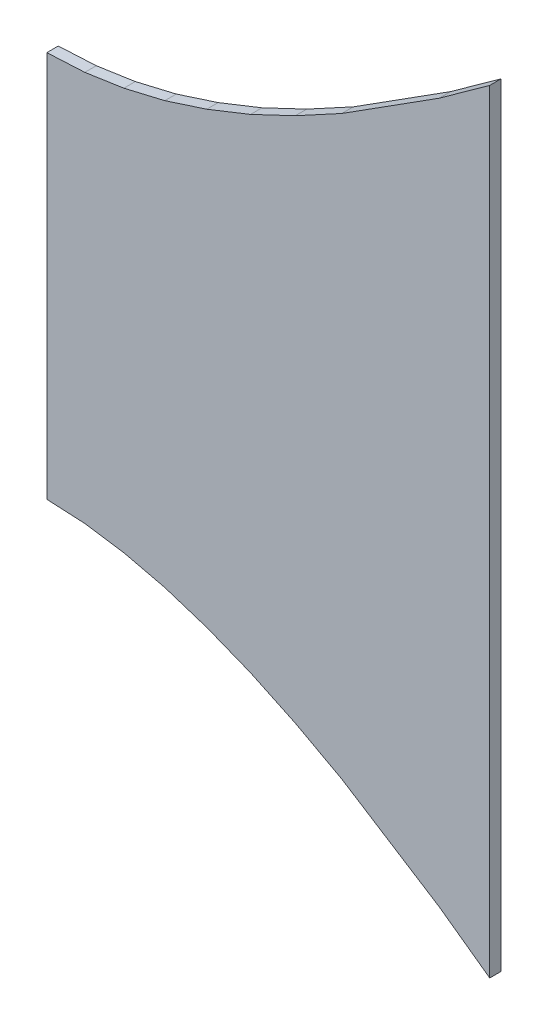
ISO-10303-21;
HEADER;
FILE_DESCRIPTION(('STEP AP214'),'2;1');
FILE_NAME('part.step','',(''),(''),'','','');
FILE_SCHEMA(('AUTOMOTIVE_DESIGN { 1 0 10303 214 1 1 1 1 }'));
ENDSEC;
DATA;
#1=APPLICATION_CONTEXT('core data for automotive mechanical design processes');
#2=APPLICATION_PROTOCOL_DEFINITION('international standard','automotive_design',2000,#1);
#3=PRODUCT_CONTEXT('',#1,'mechanical');
#4=PRODUCT('Part','Part','',(#3));
#5=PRODUCT_RELATED_PRODUCT_CATEGORY('part','',(#4));
#6=PRODUCT_DEFINITION_FORMATION('','',#4);
#7=PRODUCT_DEFINITION_CONTEXT('part definition',#1,'design');
#8=PRODUCT_DEFINITION('design','',#6,#7);
#9=PRODUCT_DEFINITION_SHAPE('','',#8);
#10=(LENGTH_UNIT() NAMED_UNIT(*) SI_UNIT(.MILLI.,.METRE.));
#11=(NAMED_UNIT(*) PLANE_ANGLE_UNIT() SI_UNIT($,.RADIAN.));
#12=(NAMED_UNIT(*) SI_UNIT($,.STERADIAN.) SOLID_ANGLE_UNIT());
#13=UNCERTAINTY_MEASURE_WITH_UNIT(LENGTH_MEASURE(1.E-05),#10,'distance_accuracy_value','');
#14=(GEOMETRIC_REPRESENTATION_CONTEXT(3) GLOBAL_UNCERTAINTY_ASSIGNED_CONTEXT((#13)) GLOBAL_UNIT_ASSIGNED_CONTEXT((#10,
#11,#12)) REPRESENTATION_CONTEXT('',''));
#15=CARTESIAN_POINT('',(0.,0.,0.));
#16=DIRECTION('',(0.,0.,1.));
#17=DIRECTION('',(1.,0.,0.));
#18=AXIS2_PLACEMENT_3D('',#15,#16,#17);
#19=CARTESIAN_POINT('',(99.2050018310547,41.9000015258789,0.));
#20=DIRECTION('',(0.050787856813792,0.998709464058623,0.));
#21=DIRECTION('',(0.998709464058623,-0.050787856813792,0.));
#22=AXIS2_PLACEMENT_3D('',#19,#20,#21);
#23=PLANE('',#22);
#24=DIRECTION('',(0.998709464058623,-0.050787856813792,0.));
#25=VECTOR('',#24,1.);
#26=CARTESIAN_POINT('',(99.2050018310547,41.9000015258789,0.03556));
#27=LINE('',#26,#25);
#28=CARTESIAN_POINT('',(99.2050018310547,41.9000015258789,0.03556));
#29=VERTEX_POINT('',#28);
#30=CARTESIAN_POINT('',(99.322998046875,41.8940010070801,0.03556));
#31=VERTEX_POINT('',#30);
#32=EDGE_CURVE('E11',#29,#31,#27,.T.);
#33=ORIENTED_EDGE('',*,*,#32,.F.);
#34=DIRECTION('',(0.,0.,1.));
#35=VECTOR('',#34,1.);
#36=CARTESIAN_POINT('',(99.2050018310547,41.9000015258789,0.));
#37=LINE('',#36,#35);
#38=CARTESIAN_POINT('',(99.2050018310547,41.9000015258789,0.));
#39=VERTEX_POINT('',#38);
#40=EDGE_CURVE('E24',#39,#29,#37,.T.);
#41=ORIENTED_EDGE('',*,*,#40,.F.);
#42=DIRECTION('',(0.998709464058623,-0.050787856813792,0.));
#43=VECTOR('',#42,1.);
#44=CARTESIAN_POINT('',(99.2050018310547,41.9000015258789,0.));
#45=LINE('',#44,#43);
#46=CARTESIAN_POINT('',(99.322998046875,41.8940010070801,0.));
#47=VERTEX_POINT('',#46);
#48=EDGE_CURVE('E172',#39,#47,#45,.T.);
#49=ORIENTED_EDGE('',*,*,#48,.T.);
#50=DIRECTION('',(0.,0.,1.));
#51=VECTOR('',#50,1.);
#52=CARTESIAN_POINT('',(99.322998046875,41.8940010070801,0.));
#53=LINE('',#52,#51);
#54=EDGE_CURVE('E37',#47,#31,#53,.T.);
#55=ORIENTED_EDGE('',*,*,#54,.T.);
#56=EDGE_LOOP('',(#33,#41,#49,#55));
#57=FACE_BOUND('',#56,.T.);
#58=ADVANCED_FACE('F17',(#57),#23,.F.);
#59=CARTESIAN_POINT('',(99.322998046875,41.8940010070801,0.));
#60=DIRECTION('',(0.147150982498045,0.989114042135617,0.));
#61=DIRECTION('',(0.989114042135617,-0.147150982498045,0.));
#62=AXIS2_PLACEMENT_3D('',#59,#60,#61);
#63=PLANE('',#62);
#64=DIRECTION('',(0.989114042135617,-0.147150982498045,0.));
#65=VECTOR('',#64,1.);
#66=CARTESIAN_POINT('',(99.322998046875,41.8940010070801,0.03556));
#67=LINE('',#66,#65);
#68=CARTESIAN_POINT('',(99.4440002441406,41.8759994506836,0.03556));
#69=VERTEX_POINT('',#68);
#70=EDGE_CURVE('E308',#31,#69,#67,.T.);
#71=ORIENTED_EDGE('',*,*,#70,.F.);
#72=ORIENTED_EDGE('',*,*,#54,.F.);
#73=DIRECTION('',(0.989114042135617,-0.147150982498045,0.));
#74=VECTOR('',#73,1.);
#75=CARTESIAN_POINT('',(99.322998046875,41.8940010070801,0.));
#76=LINE('',#75,#74);
#77=CARTESIAN_POINT('',(99.4440002441406,41.8759994506836,0.));
#78=VERTEX_POINT('',#77);
#79=EDGE_CURVE('E305',#47,#78,#76,.T.);
#80=ORIENTED_EDGE('',*,*,#79,.T.);
#81=DIRECTION('',(0.,0.,1.));
#82=VECTOR('',#81,1.);
#83=CARTESIAN_POINT('',(99.4440002441406,41.8759994506836,0.));
#84=LINE('',#83,#82);
#85=EDGE_CURVE('E303',#78,#69,#84,.T.);
#86=ORIENTED_EDGE('',*,*,#85,.T.);
#87=EDGE_LOOP('',(#71,#72,#80,#86));
#88=FACE_BOUND('',#87,.T.);
#89=ADVANCED_FACE('F316',(#88),#63,.F.);
#90=CARTESIAN_POINT('',(99.4440002441406,41.8759994506836,0.));
#91=DIRECTION('',(0.229886518123025,0.973217441677487,0.));
#92=DIRECTION('',(0.973217441677487,-0.229886518123025,0.));
#93=AXIS2_PLACEMENT_3D('',#90,#91,#92);
#94=PLANE('',#93);
#95=DIRECTION('',(0.973217441677487,-0.229886518123025,0.));
#96=VECTOR('',#95,1.);
#97=CARTESIAN_POINT('',(99.4440002441406,41.8759994506836,0.03556));
#98=LINE('',#97,#96);
#99=CARTESIAN_POINT('',(99.5709991455078,41.8460006713867,0.03556));
#100=VERTEX_POINT('',#99);
#101=EDGE_CURVE('E300',#69,#100,#98,.T.);
#102=ORIENTED_EDGE('',*,*,#101,.F.);
#103=ORIENTED_EDGE('',*,*,#85,.F.);
#104=DIRECTION('',(0.973217441677487,-0.229886518123025,0.));
#105=VECTOR('',#104,1.);
#106=CARTESIAN_POINT('',(99.4440002441406,41.8759994506836,0.));
#107=LINE('',#106,#105);
#108=CARTESIAN_POINT('',(99.5709991455078,41.8460006713867,0.));
#109=VERTEX_POINT('',#108);
#110=EDGE_CURVE('E297',#78,#109,#107,.T.);
#111=ORIENTED_EDGE('',*,*,#110,.T.);
#112=DIRECTION('',(0.,0.,1.));
#113=VECTOR('',#112,1.);
#114=CARTESIAN_POINT('',(99.5709991455078,41.8460006713867,0.));
#115=LINE('',#114,#113);
#116=EDGE_CURVE('E295',#109,#100,#115,.T.);
#117=ORIENTED_EDGE('',*,*,#116,.T.);
#118=EDGE_LOOP('',(#102,#103,#111,#117));
#119=FACE_BOUND('',#118,.T.);
#120=ADVANCED_FACE('F322',(#119),#94,.F.);
#121=CARTESIAN_POINT('',(99.5709991455078,41.8460006713867,0.));
#122=DIRECTION('',(0.307435150920804,0.951569034793747,0.));
#123=DIRECTION('',(0.951569034793747,-0.307435150920804,0.));
#124=AXIS2_PLACEMENT_3D('',#121,#122,#123);
#125=PLANE('',#124);
#126=DIRECTION('',(0.951569034793747,-0.307435150920804,0.));
#127=VECTOR('',#126,1.);
#128=CARTESIAN_POINT('',(99.5709991455078,41.8460006713867,0.03556));
#129=LINE('',#128,#127);
#130=CARTESIAN_POINT('',(99.7009963989258,41.8040008544922,0.03556));
#131=VERTEX_POINT('',#130);
#132=EDGE_CURVE('E292',#100,#131,#129,.T.);
#133=ORIENTED_EDGE('',*,*,#132,.F.);
#134=ORIENTED_EDGE('',*,*,#116,.F.);
#135=DIRECTION('',(0.951569034793747,-0.307435150920804,0.));
#136=VECTOR('',#135,1.);
#137=CARTESIAN_POINT('',(99.5709991455078,41.8460006713867,0.));
#138=LINE('',#137,#136);
#139=CARTESIAN_POINT('',(99.7009963989258,41.8040008544922,0.));
#140=VERTEX_POINT('',#139);
#141=EDGE_CURVE('E289',#109,#140,#138,.T.);
#142=ORIENTED_EDGE('',*,*,#141,.T.);
#143=DIRECTION('',(0.,0.,1.));
#144=VECTOR('',#143,1.);
#145=CARTESIAN_POINT('',(99.7009963989258,41.8040008544922,0.));
#146=LINE('',#145,#144);
#147=EDGE_CURVE('E287',#140,#131,#146,.T.);
#148=ORIENTED_EDGE('',*,*,#147,.T.);
#149=EDGE_LOOP('',(#133,#134,#142,#148));
#150=FACE_BOUND('',#149,.T.);
#151=ADVANCED_FACE('F324',(#150),#125,.F.);
#152=CARTESIAN_POINT('',(99.7009963989258,41.8040008544922,0.));
#153=DIRECTION('',(0.369034272551791,0.929415787299834,0.));
#154=DIRECTION('',(0.929415787299834,-0.369034272551791,0.));
#155=AXIS2_PLACEMENT_3D('',#152,#153,#154);
#156=PLANE('',#155);
#157=DIRECTION('',(0.929415787299834,-0.369034272551791,0.));
#158=VECTOR('',#157,1.);
#159=CARTESIAN_POINT('',(99.7009963989258,41.8040008544922,0.03556));
#160=LINE('',#159,#158);
#161=CARTESIAN_POINT('',(99.8369979858398,41.75,0.03556));
#162=VERTEX_POINT('',#161);
#163=EDGE_CURVE('E284',#131,#162,#160,.T.);
#164=ORIENTED_EDGE('',*,*,#163,.F.);
#165=ORIENTED_EDGE('',*,*,#147,.F.);
#166=DIRECTION('',(0.929415787299834,-0.369034272551791,0.));
#167=VECTOR('',#166,1.);
#168=CARTESIAN_POINT('',(99.7009963989258,41.8040008544922,0.));
#169=LINE('',#168,#167);
#170=CARTESIAN_POINT('',(99.8369979858398,41.75,0.));
#171=VERTEX_POINT('',#170);
#172=EDGE_CURVE('E281',#140,#171,#169,.T.);
#173=ORIENTED_EDGE('',*,*,#172,.T.);
#174=DIRECTION('',(0.,0.,1.));
#175=VECTOR('',#174,1.);
#176=CARTESIAN_POINT('',(99.8369979858398,41.75,0.));
#177=LINE('',#176,#175);
#178=EDGE_CURVE('E279',#171,#162,#177,.T.);
#179=ORIENTED_EDGE('',*,*,#178,.T.);
#180=EDGE_LOOP('',(#164,#165,#173,#179));
#181=FACE_BOUND('',#180,.T.);
#182=ADVANCED_FACE('F329',(#181),#156,.F.);
#183=CARTESIAN_POINT('',(99.8369979858399,41.75,0.));
#184=DIRECTION('',(0.428934435725172,0.903335624144829,0.));
#185=DIRECTION('',(0.903335624144829,-0.428934435725172,0.));
#186=AXIS2_PLACEMENT_3D('',#183,#184,#185);
#187=PLANE('',#186);
#188=DIRECTION('',(0.903335624144829,-0.428934435725172,0.));
#189=VECTOR('',#188,1.);
#190=CARTESIAN_POINT('',(99.8369979858398,41.75,0.03556));
#191=LINE('',#190,#189);
#192=CARTESIAN_POINT('',(99.9759979248047,41.6839981079102,0.03556));
#193=VERTEX_POINT('',#192);
#194=EDGE_CURVE('E276',#162,#193,#191,.T.);
#195=ORIENTED_EDGE('',*,*,#194,.F.);
#196=ORIENTED_EDGE('',*,*,#178,.F.);
#197=DIRECTION('',(0.903335624144829,-0.428934435725172,0.));
#198=VECTOR('',#197,1.);
#199=CARTESIAN_POINT('',(99.8369979858398,41.75,0.));
#200=LINE('',#199,#198);
#201=CARTESIAN_POINT('',(99.9759979248047,41.6839981079102,0.));
#202=VERTEX_POINT('',#201);
#203=EDGE_CURVE('E273',#171,#202,#200,.T.);
#204=ORIENTED_EDGE('',*,*,#203,.T.);
#205=DIRECTION('',(0.,0.,1.));
#206=VECTOR('',#205,1.);
#207=CARTESIAN_POINT('',(99.9759979248047,41.6839981079102,0.));
#208=LINE('',#207,#206);
#209=EDGE_CURVE('E271',#202,#193,#208,.T.);
#210=ORIENTED_EDGE('',*,*,#209,.T.);
#211=EDGE_LOOP('',(#195,#196,#204,#210));
#212=FACE_BOUND('',#211,.T.);
#213=ADVANCED_FACE('F332',(#212),#187,.F.);
#214=CARTESIAN_POINT('',(99.9759979248047,41.6839981079102,0.));
#215=DIRECTION('',(0.476266640314066,0.879300908292464,0.));
#216=DIRECTION('',(0.879300908292464,-0.476266640314066,0.));
#217=AXIS2_PLACEMENT_3D('',#214,#215,#216);
#218=PLANE('',#217);
#219=DIRECTION('',(0.879300908292464,-0.476266640314066,0.));
#220=VECTOR('',#219,1.);
#221=CARTESIAN_POINT('',(99.9759979248047,41.6839981079102,0.03556));
#222=LINE('',#221,#220);
#223=CARTESIAN_POINT('',(100.120002746582,41.6059989929199,0.03556));
#224=VERTEX_POINT('',#223);
#225=EDGE_CURVE('E268',#193,#224,#222,.T.);
#226=ORIENTED_EDGE('',*,*,#225,.F.);
#227=ORIENTED_EDGE('',*,*,#209,.F.);
#228=DIRECTION('',(0.879300908292464,-0.476266640314066,0.));
#229=VECTOR('',#228,1.);
#230=CARTESIAN_POINT('',(99.9759979248047,41.6839981079102,0.));
#231=LINE('',#230,#229);
#232=CARTESIAN_POINT('',(100.120002746582,41.6059989929199,0.));
#233=VERTEX_POINT('',#232);
#234=EDGE_CURVE('E265',#202,#233,#231,.T.);
#235=ORIENTED_EDGE('',*,*,#234,.T.);
#236=DIRECTION('',(0.,0.,1.));
#237=VECTOR('',#236,1.);
#238=CARTESIAN_POINT('',(100.120002746582,41.6059989929199,0.));
#239=LINE('',#238,#237);
#240=EDGE_CURVE('E263',#233,#224,#239,.T.);
#241=ORIENTED_EDGE('',*,*,#240,.T.);
#242=EDGE_LOOP('',(#226,#227,#235,#241));
#243=FACE_BOUND('',#242,.T.);
#244=ADVANCED_FACE('F337',(#243),#218,.F.);
#245=CARTESIAN_POINT('',(100.120002746582,41.6059989929199,0.));
#246=DIRECTION('',(0.536516084366623,0.84389009427526,0.));
#247=DIRECTION('',(0.84389009427526,-0.536516084366623,0.));
#248=AXIS2_PLACEMENT_3D('',#245,#246,#247);
#249=PLANE('',#248);
#250=DIRECTION('',(0.84389009427526,-0.536516084366623,0.));
#251=VECTOR('',#250,1.);
#252=CARTESIAN_POINT('',(100.120002746582,41.6059989929199,0.03556));
#253=LINE('',#252,#251);
#254=CARTESIAN_POINT('',(100.421997070312,41.4140014648437,0.03556));
#255=VERTEX_POINT('',#254);
#256=EDGE_CURVE('E260',#224,#255,#253,.T.);
#257=ORIENTED_EDGE('',*,*,#256,.F.);
#258=ORIENTED_EDGE('',*,*,#240,.F.);
#259=DIRECTION('',(0.84389009427526,-0.536516084366623,0.));
#260=VECTOR('',#259,1.);
#261=CARTESIAN_POINT('',(100.120002746582,41.6059989929199,0.));
#262=LINE('',#261,#260);
#263=CARTESIAN_POINT('',(100.421997070312,41.4140014648437,0.));
#264=VERTEX_POINT('',#263);
#265=EDGE_CURVE('E257',#233,#264,#262,.T.);
#266=ORIENTED_EDGE('',*,*,#265,.T.);
#267=DIRECTION('',(0.,0.,1.));
#268=VECTOR('',#267,1.);
#269=CARTESIAN_POINT('',(100.421997070312,41.4140014648437,0.));
#270=LINE('',#269,#268);
#271=EDGE_CURVE('E255',#264,#255,#270,.T.);
#272=ORIENTED_EDGE('',*,*,#271,.T.);
#273=EDGE_LOOP('',(#257,#258,#266,#272));
#274=FACE_BOUND('',#273,.T.);
#275=ADVANCED_FACE('F340',(#274),#249,.F.);
#276=CARTESIAN_POINT('',(100.421997070312,41.4140014648437,0.));
#277=DIRECTION('',(0.584164973381568,0.811634944956236,0.));
#278=DIRECTION('',(0.811634944956236,-0.584164973381568,0.));
#279=AXIS2_PLACEMENT_3D('',#276,#277,#278);
#280=PLANE('',#279);
#281=DIRECTION('',(0.811634944956236,-0.584164973381568,0.));
#282=VECTOR('',#281,1.);
#283=CARTESIAN_POINT('',(100.421997070312,41.4140014648437,0.03556));
#284=LINE('',#283,#282);
#285=CARTESIAN_POINT('',(100.579002380371,41.3009986877441,0.03556));
#286=VERTEX_POINT('',#285);
#287=EDGE_CURVE('E252',#255,#286,#284,.T.);
#288=ORIENTED_EDGE('',*,*,#287,.F.);
#289=ORIENTED_EDGE('',*,*,#271,.F.);
#290=DIRECTION('',(0.811634944956236,-0.584164973381568,0.));
#291=VECTOR('',#290,1.);
#292=CARTESIAN_POINT('',(100.421997070312,41.4140014648437,0.));
#293=LINE('',#292,#291);
#294=CARTESIAN_POINT('',(100.579002380371,41.3009986877441,0.));
#295=VERTEX_POINT('',#294);
#296=EDGE_CURVE('E249',#264,#295,#293,.T.);
#297=ORIENTED_EDGE('',*,*,#296,.T.);
#298=DIRECTION('',(0.,0.,1.));
#299=VECTOR('',#298,1.);
#300=CARTESIAN_POINT('',(100.579002380371,41.3009986877441,0.));
#301=LINE('',#300,#299);
#302=EDGE_CURVE('E247',#295,#286,#301,.T.);
#303=ORIENTED_EDGE('',*,*,#302,.T.);
#304=EDGE_LOOP('',(#288,#289,#297,#303));
#305=FACE_BOUND('',#304,.T.);
#306=ADVANCED_FACE('F345',(#305),#280,.F.);
#307=CARTESIAN_POINT('',(100.579002380371,41.3009986877442,0.));
#308=DIRECTION('',(-1.,0.,0.));
#309=DIRECTION('',(0.,1.,0.));
#310=AXIS2_PLACEMENT_3D('',#307,#308,#309);
#311=PLANE('',#310);
#312=DIRECTION('',(0.,1.,0.));
#313=VECTOR('',#312,1.);
#314=CARTESIAN_POINT('',(100.579002380371,41.3009986877441,0.03556));
#315=LINE('',#314,#313);
#316=CARTESIAN_POINT('',(100.579002380371,43.6990013122559,0.03556));
#317=VERTEX_POINT('',#316);
#318=EDGE_CURVE('E244',#286,#317,#315,.T.);
#319=ORIENTED_EDGE('',*,*,#318,.F.);
#320=ORIENTED_EDGE('',*,*,#302,.F.);
#321=DIRECTION('',(0.,1.,0.));
#322=VECTOR('',#321,1.);
#323=CARTESIAN_POINT('',(100.579002380371,41.3009986877441,0.));
#324=LINE('',#323,#322);
#325=CARTESIAN_POINT('',(100.579002380371,43.6990013122559,0.));
#326=VERTEX_POINT('',#325);
#327=EDGE_CURVE('E241',#295,#326,#324,.T.);
#328=ORIENTED_EDGE('',*,*,#327,.T.);
#329=DIRECTION('',(0.,0.,1.));
#330=VECTOR('',#329,1.);
#331=CARTESIAN_POINT('',(100.579002380371,43.6990013122559,0.));
#332=LINE('',#331,#330);
#333=EDGE_CURVE('E239',#326,#317,#332,.T.);
#334=ORIENTED_EDGE('',*,*,#333,.T.);
#335=EDGE_LOOP('',(#319,#320,#328,#334));
#336=FACE_BOUND('',#335,.T.);
#337=ADVANCED_FACE('F348',(#336),#311,.F.);
#338=CARTESIAN_POINT('',(100.579002380371,43.6990013122559,0.));
#339=DIRECTION('',(0.584164973381568,-0.811634944956236,0.));
#340=DIRECTION('',(-0.811634944956236,-0.584164973381568,0.));
#341=AXIS2_PLACEMENT_3D('',#338,#339,#340);
#342=PLANE('',#341);
#343=DIRECTION('',(-0.811634944956236,-0.584164973381568,0.));
#344=VECTOR('',#343,1.);
#345=CARTESIAN_POINT('',(100.579002380371,43.6990013122559,0.03556));
#346=LINE('',#345,#344);
#347=CARTESIAN_POINT('',(100.421997070312,43.5859985351562,0.03556));
#348=VERTEX_POINT('',#347);
#349=EDGE_CURVE('E236',#317,#348,#346,.T.);
#350=ORIENTED_EDGE('',*,*,#349,.F.);
#351=ORIENTED_EDGE('',*,*,#333,.F.);
#352=DIRECTION('',(-0.811634944956236,-0.584164973381568,0.));
#353=VECTOR('',#352,1.);
#354=CARTESIAN_POINT('',(100.579002380371,43.6990013122559,0.));
#355=LINE('',#354,#353);
#356=CARTESIAN_POINT('',(100.421997070312,43.5859985351562,0.));
#357=VERTEX_POINT('',#356);
#358=EDGE_CURVE('E233',#326,#357,#355,.T.);
#359=ORIENTED_EDGE('',*,*,#358,.T.);
#360=DIRECTION('',(0.,0.,1.));
#361=VECTOR('',#360,1.);
#362=CARTESIAN_POINT('',(100.421997070312,43.5859985351562,0.));
#363=LINE('',#362,#361);
#364=EDGE_CURVE('E231',#357,#348,#363,.T.);
#365=ORIENTED_EDGE('',*,*,#364,.T.);
#366=EDGE_LOOP('',(#350,#351,#359,#365));
#367=FACE_BOUND('',#366,.T.);
#368=ADVANCED_FACE('F353',(#367),#342,.F.);
#369=CARTESIAN_POINT('',(100.421997070312,43.5859985351562,0.));
#370=DIRECTION('',(0.536516084366623,-0.84389009427526,0.));
#371=DIRECTION('',(-0.84389009427526,-0.536516084366623,0.));
#372=AXIS2_PLACEMENT_3D('',#369,#370,#371);
#373=PLANE('',#372);
#374=DIRECTION('',(-0.84389009427526,-0.536516084366623,0.));
#375=VECTOR('',#374,1.);
#376=CARTESIAN_POINT('',(100.421997070312,43.5859985351562,0.03556));
#377=LINE('',#376,#375);
#378=CARTESIAN_POINT('',(100.120002746582,43.3940010070801,0.03556));
#379=VERTEX_POINT('',#378);
#380=EDGE_CURVE('E228',#348,#379,#377,.T.);
#381=ORIENTED_EDGE('',*,*,#380,.F.);
#382=ORIENTED_EDGE('',*,*,#364,.F.);
#383=DIRECTION('',(-0.84389009427526,-0.536516084366623,0.));
#384=VECTOR('',#383,1.);
#385=CARTESIAN_POINT('',(100.421997070312,43.5859985351562,0.));
#386=LINE('',#385,#384);
#387=CARTESIAN_POINT('',(100.120002746582,43.3940010070801,0.));
#388=VERTEX_POINT('',#387);
#389=EDGE_CURVE('E225',#357,#388,#386,.T.);
#390=ORIENTED_EDGE('',*,*,#389,.T.);
#391=DIRECTION('',(0.,0.,1.));
#392=VECTOR('',#391,1.);
#393=CARTESIAN_POINT('',(100.120002746582,43.3940010070801,0.));
#394=LINE('',#393,#392);
#395=EDGE_CURVE('E223',#388,#379,#394,.T.);
#396=ORIENTED_EDGE('',*,*,#395,.T.);
#397=EDGE_LOOP('',(#381,#382,#390,#396));
#398=FACE_BOUND('',#397,.T.);
#399=ADVANCED_FACE('F356',(#398),#373,.F.);
#400=CARTESIAN_POINT('',(100.120002746582,43.3940010070801,0.));
#401=DIRECTION('',(0.476266640314066,-0.879300908292464,0.));
#402=DIRECTION('',(-0.879300908292464,-0.476266640314066,0.));
#403=AXIS2_PLACEMENT_3D('',#400,#401,#402);
#404=PLANE('',#403);
#405=DIRECTION('',(-0.879300908292464,-0.476266640314066,0.));
#406=VECTOR('',#405,1.);
#407=CARTESIAN_POINT('',(100.120002746582,43.3940010070801,0.03556));
#408=LINE('',#407,#406);
#409=CARTESIAN_POINT('',(99.9759979248047,43.3160018920898,0.03556));
#410=VERTEX_POINT('',#409);
#411=EDGE_CURVE('E220',#379,#410,#408,.T.);
#412=ORIENTED_EDGE('',*,*,#411,.F.);
#413=ORIENTED_EDGE('',*,*,#395,.F.);
#414=DIRECTION('',(-0.879300908292464,-0.476266640314066,0.));
#415=VECTOR('',#414,1.);
#416=CARTESIAN_POINT('',(100.120002746582,43.3940010070801,0.));
#417=LINE('',#416,#415);
#418=CARTESIAN_POINT('',(99.9759979248047,43.3160018920898,0.));
#419=VERTEX_POINT('',#418);
#420=EDGE_CURVE('E217',#388,#419,#417,.T.);
#421=ORIENTED_EDGE('',*,*,#420,.T.);
#422=DIRECTION('',(0.,0.,1.));
#423=VECTOR('',#422,1.);
#424=CARTESIAN_POINT('',(99.9759979248047,43.3160018920898,0.));
#425=LINE('',#424,#423);
#426=EDGE_CURVE('E215',#419,#410,#425,.T.);
#427=ORIENTED_EDGE('',*,*,#426,.T.);
#428=EDGE_LOOP('',(#412,#413,#421,#427));
#429=FACE_BOUND('',#428,.T.);
#430=ADVANCED_FACE('F361',(#429),#404,.F.);
#431=CARTESIAN_POINT('',(99.9759979248047,43.3160018920898,0.));
#432=DIRECTION('',(0.428934435725172,-0.903335624144829,0.));
#433=DIRECTION('',(-0.903335624144829,-0.428934435725172,0.));
#434=AXIS2_PLACEMENT_3D('',#431,#432,#433);
#435=PLANE('',#434);
#436=DIRECTION('',(-0.903335624144829,-0.428934435725172,0.));
#437=VECTOR('',#436,1.);
#438=CARTESIAN_POINT('',(99.9759979248047,43.3160018920898,0.03556));
#439=LINE('',#438,#437);
#440=CARTESIAN_POINT('',(99.8369979858398,43.25,0.03556));
#441=VERTEX_POINT('',#440);
#442=EDGE_CURVE('E212',#410,#441,#439,.T.);
#443=ORIENTED_EDGE('',*,*,#442,.F.);
#444=ORIENTED_EDGE('',*,*,#426,.F.);
#445=DIRECTION('',(-0.903335624144829,-0.428934435725172,0.));
#446=VECTOR('',#445,1.);
#447=CARTESIAN_POINT('',(99.9759979248047,43.3160018920898,0.));
#448=LINE('',#447,#446);
#449=CARTESIAN_POINT('',(99.8369979858398,43.25,0.));
#450=VERTEX_POINT('',#449);
#451=EDGE_CURVE('E209',#419,#450,#448,.T.);
#452=ORIENTED_EDGE('',*,*,#451,.T.);
#453=DIRECTION('',(0.,0.,1.));
#454=VECTOR('',#453,1.);
#455=CARTESIAN_POINT('',(99.8369979858398,43.25,0.));
#456=LINE('',#455,#454);
#457=EDGE_CURVE('E207',#450,#441,#456,.T.);
#458=ORIENTED_EDGE('',*,*,#457,.T.);
#459=EDGE_LOOP('',(#443,#444,#452,#458));
#460=FACE_BOUND('',#459,.T.);
#461=ADVANCED_FACE('F364',(#460),#435,.F.);
#462=CARTESIAN_POINT('',(99.8369979858399,43.25,0.));
#463=DIRECTION('',(0.369034272551791,-0.929415787299834,0.));
#464=DIRECTION('',(-0.929415787299834,-0.369034272551791,0.));
#465=AXIS2_PLACEMENT_3D('',#462,#463,#464);
#466=PLANE('',#465);
#467=DIRECTION('',(-0.929415787299834,-0.369034272551791,0.));
#468=VECTOR('',#467,1.);
#469=CARTESIAN_POINT('',(99.8369979858398,43.25,0.03556));
#470=LINE('',#469,#468);
#471=CARTESIAN_POINT('',(99.7009963989258,43.1959991455078,0.03556));
#472=VERTEX_POINT('',#471);
#473=EDGE_CURVE('E204',#441,#472,#470,.T.);
#474=ORIENTED_EDGE('',*,*,#473,.F.);
#475=ORIENTED_EDGE('',*,*,#457,.F.);
#476=DIRECTION('',(-0.929415787299834,-0.369034272551791,0.));
#477=VECTOR('',#476,1.);
#478=CARTESIAN_POINT('',(99.8369979858398,43.25,0.));
#479=LINE('',#478,#477);
#480=CARTESIAN_POINT('',(99.7009963989258,43.1959991455078,0.));
#481=VERTEX_POINT('',#480);
#482=EDGE_CURVE('E201',#450,#481,#479,.T.);
#483=ORIENTED_EDGE('',*,*,#482,.T.);
#484=DIRECTION('',(0.,0.,1.));
#485=VECTOR('',#484,1.);
#486=CARTESIAN_POINT('',(99.7009963989258,43.1959991455078,0.));
#487=LINE('',#486,#485);
#488=EDGE_CURVE('E199',#481,#472,#487,.T.);
#489=ORIENTED_EDGE('',*,*,#488,.T.);
#490=EDGE_LOOP('',(#474,#475,#483,#489));
#491=FACE_BOUND('',#490,.T.);
#492=ADVANCED_FACE('F369',(#491),#466,.F.);
#493=CARTESIAN_POINT('',(99.7009963989258,43.1959991455078,0.));
#494=DIRECTION('',(0.307435150920804,-0.951569034793747,0.));
#495=DIRECTION('',(-0.951569034793747,-0.307435150920804,0.));
#496=AXIS2_PLACEMENT_3D('',#493,#494,#495);
#497=PLANE('',#496);
#498=DIRECTION('',(-0.951569034793747,-0.307435150920804,0.));
#499=VECTOR('',#498,1.);
#500=CARTESIAN_POINT('',(99.7009963989258,43.1959991455078,0.03556));
#501=LINE('',#500,#499);
#502=CARTESIAN_POINT('',(99.5709991455078,43.1539993286133,0.03556));
#503=VERTEX_POINT('',#502);
#504=EDGE_CURVE('E196',#472,#503,#501,.T.);
#505=ORIENTED_EDGE('',*,*,#504,.F.);
#506=ORIENTED_EDGE('',*,*,#488,.F.);
#507=DIRECTION('',(-0.951569034793747,-0.307435150920804,0.));
#508=VECTOR('',#507,1.);
#509=CARTESIAN_POINT('',(99.7009963989258,43.1959991455078,0.));
#510=LINE('',#509,#508);
#511=CARTESIAN_POINT('',(99.5709991455078,43.1539993286133,0.));
#512=VERTEX_POINT('',#511);
#513=EDGE_CURVE('E193',#481,#512,#510,.T.);
#514=ORIENTED_EDGE('',*,*,#513,.T.);
#515=DIRECTION('',(0.,0.,1.));
#516=VECTOR('',#515,1.);
#517=CARTESIAN_POINT('',(99.5709991455078,43.1539993286133,0.));
#518=LINE('',#517,#516);
#519=EDGE_CURVE('E191',#512,#503,#518,.T.);
#520=ORIENTED_EDGE('',*,*,#519,.T.);
#521=EDGE_LOOP('',(#505,#506,#514,#520));
#522=FACE_BOUND('',#521,.T.);
#523=ADVANCED_FACE('F372',(#522),#497,.F.);
#524=CARTESIAN_POINT('',(99.5709991455078,43.1539993286133,0.));
#525=DIRECTION('',(0.229886518123025,-0.973217441677487,0.));
#526=DIRECTION('',(-0.973217441677487,-0.229886518123025,0.));
#527=AXIS2_PLACEMENT_3D('',#524,#525,#526);
#528=PLANE('',#527);
#529=DIRECTION('',(-0.973217441677487,-0.229886518123025,0.));
#530=VECTOR('',#529,1.);
#531=CARTESIAN_POINT('',(99.5709991455078,43.1539993286133,0.03556));
#532=LINE('',#531,#530);
#533=CARTESIAN_POINT('',(99.4440002441406,43.1240005493164,0.03556));
#534=VERTEX_POINT('',#533);
#535=EDGE_CURVE('E188',#503,#534,#532,.T.);
#536=ORIENTED_EDGE('',*,*,#535,.F.);
#537=ORIENTED_EDGE('',*,*,#519,.F.);
#538=DIRECTION('',(-0.973217441677487,-0.229886518123025,0.));
#539=VECTOR('',#538,1.);
#540=CARTESIAN_POINT('',(99.5709991455078,43.1539993286133,0.));
#541=LINE('',#540,#539);
#542=CARTESIAN_POINT('',(99.4440002441406,43.1240005493164,0.));
#543=VERTEX_POINT('',#542);
#544=EDGE_CURVE('E185',#512,#543,#541,.T.);
#545=ORIENTED_EDGE('',*,*,#544,.T.);
#546=DIRECTION('',(0.,0.,1.));
#547=VECTOR('',#546,1.);
#548=CARTESIAN_POINT('',(99.4440002441406,43.1240005493164,0.));
#549=LINE('',#548,#547);
#550=EDGE_CURVE('E183',#543,#534,#549,.T.);
#551=ORIENTED_EDGE('',*,*,#550,.T.);
#552=EDGE_LOOP('',(#536,#537,#545,#551));
#553=FACE_BOUND('',#552,.T.);
#554=ADVANCED_FACE('F377',(#553),#528,.F.);
#555=CARTESIAN_POINT('',(99.4440002441406,43.1240005493164,0.));
#556=DIRECTION('',(0.147150982498045,-0.989114042135617,0.));
#557=DIRECTION('',(-0.989114042135617,-0.147150982498045,0.));
#558=AXIS2_PLACEMENT_3D('',#555,#556,#557);
#559=PLANE('',#558);
#560=DIRECTION('',(-0.989114042135617,-0.147150982498045,0.));
#561=VECTOR('',#560,1.);
#562=CARTESIAN_POINT('',(99.4440002441406,43.1240005493164,0.03556));
#563=LINE('',#562,#561);
#564=CARTESIAN_POINT('',(99.322998046875,43.1059989929199,0.03556));
#565=VERTEX_POINT('',#564);
#566=EDGE_CURVE('E180',#534,#565,#563,.T.);
#567=ORIENTED_EDGE('',*,*,#566,.F.);
#568=ORIENTED_EDGE('',*,*,#550,.F.);
#569=DIRECTION('',(-0.989114042135617,-0.147150982498045,0.));
#570=VECTOR('',#569,1.);
#571=CARTESIAN_POINT('',(99.4440002441406,43.1240005493164,0.));
#572=LINE('',#571,#570);
#573=CARTESIAN_POINT('',(99.322998046875,43.1059989929199,0.));
#574=VERTEX_POINT('',#573);
#575=EDGE_CURVE('E178',#543,#574,#572,.T.);
#576=ORIENTED_EDGE('',*,*,#575,.T.);
#577=DIRECTION('',(0.,0.,1.));
#578=VECTOR('',#577,1.);
#579=CARTESIAN_POINT('',(99.322998046875,43.1059989929199,0.));
#580=LINE('',#579,#578);
#581=EDGE_CURVE('E163',#574,#565,#580,.T.);
#582=ORIENTED_EDGE('',*,*,#581,.T.);
#583=EDGE_LOOP('',(#567,#568,#576,#582));
#584=FACE_BOUND('',#583,.T.);
#585=ADVANCED_FACE('F379',(#584),#559,.F.);
#586=CARTESIAN_POINT('',(99.322998046875,43.1059989929199,0.));
#587=DIRECTION('',(0.050787856813792,-0.998709464058623,0.));
#588=DIRECTION('',(-0.998709464058623,-0.050787856813792,0.));
#589=AXIS2_PLACEMENT_3D('',#586,#587,#588);
#590=PLANE('',#589);
#591=DIRECTION('',(-0.998709464058623,-0.050787856813792,0.));
#592=VECTOR('',#591,1.);
#593=CARTESIAN_POINT('',(99.322998046875,43.1059989929199,0.03556));
#594=LINE('',#593,#592);
#595=CARTESIAN_POINT('',(99.2050018310547,43.0999984741211,0.03556));
#596=VERTEX_POINT('',#595);
#597=EDGE_CURVE('E167',#565,#596,#594,.T.);
#598=ORIENTED_EDGE('',*,*,#597,.F.);
#599=ORIENTED_EDGE('',*,*,#581,.F.);
#600=DIRECTION('',(-0.998709464058623,-0.050787856813792,0.));
#601=VECTOR('',#600,1.);
#602=CARTESIAN_POINT('',(99.322998046875,43.1059989929199,0.));
#603=LINE('',#602,#601);
#604=CARTESIAN_POINT('',(99.2050018310547,43.0999984741211,0.));
#605=VERTEX_POINT('',#604);
#606=EDGE_CURVE('E159',#574,#605,#603,.T.);
#607=ORIENTED_EDGE('',*,*,#606,.T.);
#608=DIRECTION('',(0.,0.,1.));
#609=VECTOR('',#608,1.);
#610=CARTESIAN_POINT('',(99.2050018310547,43.0999984741211,0.));
#611=LINE('',#610,#609);
#612=EDGE_CURVE('E149',#605,#596,#611,.T.);
#613=ORIENTED_EDGE('',*,*,#612,.T.);
#614=EDGE_LOOP('',(#598,#599,#607,#613));
#615=FACE_BOUND('',#614,.T.);
#616=ADVANCED_FACE('F162',(#615),#590,.F.);
#617=CARTESIAN_POINT('',(99.2050018310547,43.0999984741211,0.));
#618=DIRECTION('',(1.,0.,0.));
#619=DIRECTION('',(0.,-1.,0.));
#620=AXIS2_PLACEMENT_3D('',#617,#618,#619);
#621=PLANE('',#620);
#622=DIRECTION('',(0.,-1.,0.));
#623=VECTOR('',#622,1.);
#624=CARTESIAN_POINT('',(99.2050018310547,43.0999984741211,0.03556));
#625=LINE('',#624,#623);
#626=EDGE_CURVE('E155',#596,#29,#625,.T.);
#627=ORIENTED_EDGE('',*,*,#626,.F.);
#628=ORIENTED_EDGE('',*,*,#612,.F.);
#629=DIRECTION('',(0.,-1.,0.));
#630=VECTOR('',#629,1.);
#631=CARTESIAN_POINT('',(99.2050018310547,43.0999984741211,0.));
#632=LINE('',#631,#630);
#633=EDGE_CURVE('E153',#605,#39,#632,.T.);
#634=ORIENTED_EDGE('',*,*,#633,.T.);
#635=ORIENTED_EDGE('',*,*,#40,.T.);
#636=EDGE_LOOP('',(#627,#628,#634,#635));
#637=FACE_BOUND('',#636,.T.);
#638=ADVANCED_FACE('F151',(#637),#621,.F.);
#639=CARTESIAN_POINT('',(99.2050018310547,41.9000015258789,0.));
#640=DIRECTION('',(0.,0.,1.));
#641=DIRECTION('',(1.,0.,0.));
#642=AXIS2_PLACEMENT_3D('',#639,#640,#641);
#643=PLANE('',#642);
#644=ORIENTED_EDGE('',*,*,#633,.F.);
#645=ORIENTED_EDGE('',*,*,#606,.F.);
#646=ORIENTED_EDGE('',*,*,#575,.F.);
#647=ORIENTED_EDGE('',*,*,#544,.F.);
#648=ORIENTED_EDGE('',*,*,#513,.F.);
#649=ORIENTED_EDGE('',*,*,#482,.F.);
#650=ORIENTED_EDGE('',*,*,#451,.F.);
#651=ORIENTED_EDGE('',*,*,#420,.F.);
#652=ORIENTED_EDGE('',*,*,#389,.F.);
#653=ORIENTED_EDGE('',*,*,#358,.F.);
#654=ORIENTED_EDGE('',*,*,#327,.F.);
#655=ORIENTED_EDGE('',*,*,#296,.F.);
#656=ORIENTED_EDGE('',*,*,#265,.F.);
#657=ORIENTED_EDGE('',*,*,#234,.F.);
#658=ORIENTED_EDGE('',*,*,#203,.F.);
#659=ORIENTED_EDGE('',*,*,#172,.F.);
#660=ORIENTED_EDGE('',*,*,#141,.F.);
#661=ORIENTED_EDGE('',*,*,#110,.F.);
#662=ORIENTED_EDGE('',*,*,#79,.F.);
#663=ORIENTED_EDGE('',*,*,#48,.F.);
#664=EDGE_LOOP('',(#644,#645,#646,#647,#648,#649,#650,#651,#652,#653,#654,#655,#656,#657,#658,
#659,#660,#661,#662,#663));
#665=FACE_BOUND('',#664,.T.);
#666=ADVANCED_FACE('F170',(#665),#643,.F.);
#667=CARTESIAN_POINT('',(99.2050018310547,41.9000015258789,0.03556));
#668=DIRECTION('',(0.,0.,1.));
#669=DIRECTION('',(1.,0.,0.));
#670=AXIS2_PLACEMENT_3D('',#667,#668,#669);
#671=PLANE('',#670);
#672=ORIENTED_EDGE('',*,*,#32,.T.);
#673=ORIENTED_EDGE('',*,*,#70,.T.);
#674=ORIENTED_EDGE('',*,*,#101,.T.);
#675=ORIENTED_EDGE('',*,*,#132,.T.);
#676=ORIENTED_EDGE('',*,*,#163,.T.);
#677=ORIENTED_EDGE('',*,*,#194,.T.);
#678=ORIENTED_EDGE('',*,*,#225,.T.);
#679=ORIENTED_EDGE('',*,*,#256,.T.);
#680=ORIENTED_EDGE('',*,*,#287,.T.);
#681=ORIENTED_EDGE('',*,*,#318,.T.);
#682=ORIENTED_EDGE('',*,*,#349,.T.);
#683=ORIENTED_EDGE('',*,*,#380,.T.);
#684=ORIENTED_EDGE('',*,*,#411,.T.);
#685=ORIENTED_EDGE('',*,*,#442,.T.);
#686=ORIENTED_EDGE('',*,*,#473,.T.);
#687=ORIENTED_EDGE('',*,*,#504,.T.);
#688=ORIENTED_EDGE('',*,*,#535,.T.);
#689=ORIENTED_EDGE('',*,*,#566,.T.);
#690=ORIENTED_EDGE('',*,*,#597,.T.);
#691=ORIENTED_EDGE('',*,*,#626,.T.);
#692=EDGE_LOOP('',(#672,#673,#674,#675,#676,#677,#678,#679,#680,#681,#682,#683,#684,#685,#686,
#687,#688,#689,#690,#691));
#693=FACE_BOUND('',#692,.T.);
#694=ADVANCED_FACE('F319',(#693),#671,.T.);
#695=CLOSED_SHELL('',(#58,#89,#120,#151,#182,#213,#244,#275,#306,#337,#368,#399,#430,#461,#492,
#523,#554,#585,#616,#638,#666,#694));
#696=MANIFOLD_SOLID_BREP('B1',#695);
#697=ADVANCED_BREP_SHAPE_REPRESENTATION('',(#18,#696),#14);
#698=SHAPE_DEFINITION_REPRESENTATION(#9,#697);
ENDSEC;
END-ISO-10303-21;
